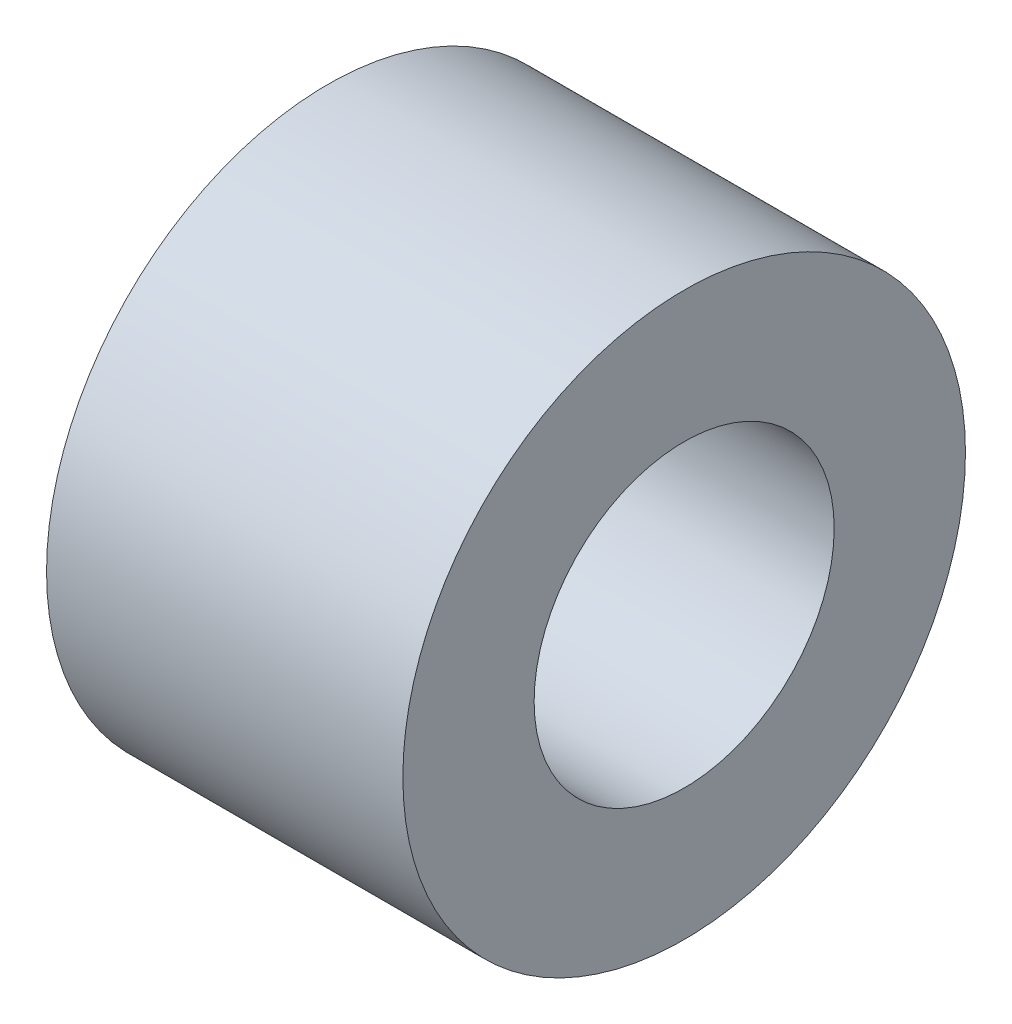
ISO-10303-21;
HEADER;
FILE_DESCRIPTION(('STEP AP214'),'2;1');
FILE_NAME('part.step','',(''),(''),'','','');
FILE_SCHEMA(('AUTOMOTIVE_DESIGN { 1 0 10303 214 1 1 1 1 }'));
ENDSEC;
DATA;
#1=APPLICATION_CONTEXT('core data for automotive mechanical design processes');
#2=APPLICATION_PROTOCOL_DEFINITION('international standard','automotive_design',2000,#1);
#3=PRODUCT_CONTEXT('',#1,'mechanical');
#4=PRODUCT('Part','Part','',(#3));
#5=PRODUCT_RELATED_PRODUCT_CATEGORY('part','',(#4));
#6=PRODUCT_DEFINITION_FORMATION('','',#4);
#7=PRODUCT_DEFINITION_CONTEXT('part definition',#1,'design');
#8=PRODUCT_DEFINITION('design','',#6,#7);
#9=PRODUCT_DEFINITION_SHAPE('','',#8);
#10=(LENGTH_UNIT() NAMED_UNIT(*) SI_UNIT(.MILLI.,.METRE.));
#11=(NAMED_UNIT(*) PLANE_ANGLE_UNIT() SI_UNIT($,.RADIAN.));
#12=(NAMED_UNIT(*) SI_UNIT($,.STERADIAN.) SOLID_ANGLE_UNIT());
#13=UNCERTAINTY_MEASURE_WITH_UNIT(LENGTH_MEASURE(1.E-05),#10,'distance_accuracy_value','');
#14=(GEOMETRIC_REPRESENTATION_CONTEXT(3) GLOBAL_UNCERTAINTY_ASSIGNED_CONTEXT((#13)) GLOBAL_UNIT_ASSIGNED_CONTEXT((#10,
#11,#12)) REPRESENTATION_CONTEXT('',''));
#15=CARTESIAN_POINT('',(0.,0.,0.));
#16=DIRECTION('',(0.,0.,1.));
#17=DIRECTION('',(1.,0.,0.));
#18=AXIS2_PLACEMENT_3D('',#15,#16,#17);
#19=CARTESIAN_POINT('',(3.8,0.,0.));
#20=DIRECTION('',(1.,0.,0.));
#21=DIRECTION('',(0.,0.,-1.));
#22=AXIS2_PLACEMENT_3D('',#19,#20,#21);
#23=PLANE('',#22);
#24=CARTESIAN_POINT('',(3.8,0.,0.));
#25=DIRECTION('',(1.,0.,0.));
#26=DIRECTION('',(0.,0.,-1.));
#27=AXIS2_PLACEMENT_3D('',#24,#25,#26);
#28=CIRCLE('',#27,3.);
#29=CARTESIAN_POINT('',(3.8,0.,3.));
#30=VERTEX_POINT('',#29);
#31=EDGE_CURVE('E10',#30,#30,#28,.T.);
#32=ORIENTED_EDGE('',*,*,#31,.T.);
#33=EDGE_LOOP('',(#32));
#34=FACE_BOUND('',#33,.T.);
#35=CARTESIAN_POINT('',(3.8,0.,0.));
#36=DIRECTION('',(1.,0.,0.));
#37=DIRECTION('',(0.,0.,-1.));
#38=AXIS2_PLACEMENT_3D('',#35,#36,#37);
#39=CIRCLE('',#38,1.6);
#40=CARTESIAN_POINT('',(3.8,0.,1.6));
#41=VERTEX_POINT('',#40);
#42=EDGE_CURVE('E43',#41,#41,#39,.T.);
#43=ORIENTED_EDGE('',*,*,#42,.F.);
#44=EDGE_LOOP('',(#43));
#45=FACE_BOUND('',#44,.T.);
#46=ADVANCED_FACE('F32',(#34,#45),#23,.T.);
#47=CARTESIAN_POINT('',(0.,0.,0.));
#48=DIRECTION('',(1.,0.,0.));
#49=DIRECTION('',(0.,0.,-1.));
#50=AXIS2_PLACEMENT_3D('',#47,#48,#49);
#51=PLANE('',#50);
#52=CARTESIAN_POINT('',(0.,0.,0.));
#53=DIRECTION('',(1.,0.,0.));
#54=DIRECTION('',(0.,0.,-1.));
#55=AXIS2_PLACEMENT_3D('',#52,#53,#54);
#56=CIRCLE('',#55,3.);
#57=CARTESIAN_POINT('',(0.,0.,3.));
#58=VERTEX_POINT('',#57);
#59=EDGE_CURVE('E36',#58,#58,#56,.T.);
#60=ORIENTED_EDGE('',*,*,#59,.F.);
#61=EDGE_LOOP('',(#60));
#62=FACE_BOUND('',#61,.T.);
#63=CARTESIAN_POINT('',(0.,0.,0.));
#64=DIRECTION('',(1.,0.,0.));
#65=DIRECTION('',(0.,0.,-1.));
#66=AXIS2_PLACEMENT_3D('',#63,#64,#65);
#67=CIRCLE('',#66,1.6);
#68=CARTESIAN_POINT('',(0.,0.,1.6));
#69=VERTEX_POINT('',#68);
#70=EDGE_CURVE('E45',#69,#69,#67,.T.);
#71=ORIENTED_EDGE('',*,*,#70,.T.);
#72=EDGE_LOOP('',(#71));
#73=FACE_BOUND('',#72,.T.);
#74=ADVANCED_FACE('F55',(#62,#73),#51,.F.);
#75=CARTESIAN_POINT('',(3.8,0.,0.));
#76=DIRECTION('',(-1.,0.,0.));
#77=DIRECTION('',(0.,0.,1.));
#78=AXIS2_PLACEMENT_3D('',#75,#76,#77);
#79=CYLINDRICAL_SURFACE('',#78,3.);
#80=CARTESIAN_POINT('',(3.8,0.,3.));
#81=CARTESIAN_POINT('',(3.76041666666667,0.,3.));
#82=CARTESIAN_POINT('',(3.72083333333333,0.,3.));
#83=CARTESIAN_POINT('',(3.64166666666667,0.,3.));
#84=CARTESIAN_POINT('',(3.60208333333333,0.,3.));
#85=CARTESIAN_POINT('',(3.52291666666667,0.,3.));
#86=CARTESIAN_POINT('',(3.48333333333333,0.,3.));
#87=CARTESIAN_POINT('',(3.40416666666667,0.,3.));
#88=CARTESIAN_POINT('',(3.36458333333333,0.,3.));
#89=CARTESIAN_POINT('',(3.28541666666667,0.,3.));
#90=CARTESIAN_POINT('',(3.24583333333333,0.,3.));
#91=CARTESIAN_POINT('',(3.16666666666667,0.,3.));
#92=CARTESIAN_POINT('',(3.12708333333333,0.,3.));
#93=CARTESIAN_POINT('',(3.04791666666667,0.,3.));
#94=CARTESIAN_POINT('',(3.00833333333333,0.,3.));
#95=CARTESIAN_POINT('',(2.92916666666667,0.,3.));
#96=CARTESIAN_POINT('',(2.88958333333333,0.,3.));
#97=CARTESIAN_POINT('',(2.81041666666667,0.,3.));
#98=CARTESIAN_POINT('',(2.77083333333333,0.,3.));
#99=CARTESIAN_POINT('',(2.69166666666667,0.,3.));
#100=CARTESIAN_POINT('',(2.65208333333333,0.,3.));
#101=CARTESIAN_POINT('',(2.57291666666667,0.,3.));
#102=CARTESIAN_POINT('',(2.53333333333333,0.,3.));
#103=CARTESIAN_POINT('',(2.45416666666667,0.,3.));
#104=CARTESIAN_POINT('',(2.41458333333333,0.,3.));
#105=CARTESIAN_POINT('',(2.33541666666667,0.,3.));
#106=CARTESIAN_POINT('',(2.29583333333333,0.,3.));
#107=CARTESIAN_POINT('',(2.21666666666667,0.,3.));
#108=CARTESIAN_POINT('',(2.17708333333333,0.,3.));
#109=CARTESIAN_POINT('',(2.09791666666667,0.,3.));
#110=CARTESIAN_POINT('',(2.05833333333333,0.,3.));
#111=CARTESIAN_POINT('',(1.97916666666667,0.,3.));
#112=CARTESIAN_POINT('',(1.93958333333333,0.,3.));
#113=CARTESIAN_POINT('',(1.86041666666667,0.,3.));
#114=CARTESIAN_POINT('',(1.82083333333333,0.,3.));
#115=CARTESIAN_POINT('',(1.74166666666667,0.,3.));
#116=CARTESIAN_POINT('',(1.70208333333333,0.,3.));
#117=CARTESIAN_POINT('',(1.62291666666667,0.,3.));
#118=CARTESIAN_POINT('',(1.58333333333333,0.,3.));
#119=CARTESIAN_POINT('',(1.50416666666667,0.,3.));
#120=CARTESIAN_POINT('',(1.46458333333333,0.,3.));
#121=CARTESIAN_POINT('',(1.38541666666667,0.,3.));
#122=CARTESIAN_POINT('',(1.34583333333333,0.,3.));
#123=CARTESIAN_POINT('',(1.26666666666667,0.,3.));
#124=CARTESIAN_POINT('',(1.22708333333333,0.,3.));
#125=CARTESIAN_POINT('',(1.14791666666667,0.,3.));
#126=CARTESIAN_POINT('',(1.10833333333333,0.,3.));
#127=CARTESIAN_POINT('',(1.02916666666667,0.,3.));
#128=CARTESIAN_POINT('',(0.989583333333333,0.,3.));
#129=CARTESIAN_POINT('',(0.910416666666667,0.,3.));
#130=CARTESIAN_POINT('',(0.870833333333333,0.,3.));
#131=CARTESIAN_POINT('',(0.791666666666667,0.,3.));
#132=CARTESIAN_POINT('',(0.752083333333333,0.,3.));
#133=CARTESIAN_POINT('',(0.672916666666667,0.,3.));
#134=CARTESIAN_POINT('',(0.633333333333333,0.,3.));
#135=CARTESIAN_POINT('',(0.554166666666667,0.,3.));
#136=CARTESIAN_POINT('',(0.514583333333334,0.,3.));
#137=CARTESIAN_POINT('',(0.435416666666667,0.,3.));
#138=CARTESIAN_POINT('',(0.395833333333333,0.,3.));
#139=CARTESIAN_POINT('',(0.316666666666666,0.,3.));
#140=CARTESIAN_POINT('',(0.277083333333333,0.,3.));
#141=CARTESIAN_POINT('',(0.197916666666667,0.,3.));
#142=CARTESIAN_POINT('',(0.158333333333333,0.,3.));
#143=CARTESIAN_POINT('',(0.0791666666666666,0.,3.));
#144=CARTESIAN_POINT('',(0.0395833333333333,0.,3.));
#145=CARTESIAN_POINT('',(0.,0.,3.));
#146=B_SPLINE_CURVE_WITH_KNOTS('',3,(#80,#81,#82,#83,#84,#85,#86,#87,#88,#89,#90,#91,#92,#93,
#94,#95,#96,#97,#98,#99,#100,#101,#102,#103,#104,#105,#106,#107,#108,#109,#110,#111,#112,#113,
#114,#115,#116,#117,#118,#119,#120,#121,#122,#123,#124,#125,#126,#127,#128,#129,#130,#131,#132,
#133,#134,#135,#136,#137,#138,#139,#140,#141,#142,#143,#144,#145),.UNSPECIFIED.,.F.,.F.,(4,2,2,
2,2,2,2,2,2,2,2,2,2,2,2,2,2,2,2,2,2,2,2,2,2,2,2,2,2,2,2,2,4),(0.,0.11875,0.2375,0.35625,0.475,
0.59375,0.7125,0.831249999999999,0.95,1.06875,1.1875,1.30625,1.425,1.54375,1.6625,1.78125,1.9,
2.01875,2.1375,2.25625,2.375,2.49375,2.6125,2.73125,2.85,2.96875,3.0875,3.20625,3.325,3.44375,
3.5625,3.68125,3.8),.UNSPECIFIED.);
#147=EDGE_CURVE('BSEAM34',#30,#58,#146,.T.);
#148=ORIENTED_EDGE('',*,*,#31,.F.);
#149=ORIENTED_EDGE('',*,*,#59,.T.);
#150=ORIENTED_EDGE('',*,*,#147,.T.);
#151=ORIENTED_EDGE('',*,*,#147,.F.);
#152=EDGE_LOOP('',(#148,#150,#149,#151));
#153=FACE_BOUND('',#152,.T.);
#154=ADVANCED_FACE('F34',(#153),#79,.T.);
#155=CARTESIAN_POINT('',(3.8,0.,0.));
#156=DIRECTION('',(-1.,0.,0.));
#157=DIRECTION('',(0.,0.,1.));
#158=AXIS2_PLACEMENT_3D('',#155,#156,#157);
#159=CYLINDRICAL_SURFACE('',#158,1.6);
#160=CARTESIAN_POINT('',(3.8,0.,1.6));
#161=CARTESIAN_POINT('',(3.76041666666667,0.,1.6));
#162=CARTESIAN_POINT('',(3.72083333333333,0.,1.6));
#163=CARTESIAN_POINT('',(3.64166666666667,0.,1.6));
#164=CARTESIAN_POINT('',(3.60208333333333,0.,1.6));
#165=CARTESIAN_POINT('',(3.52291666666667,0.,1.6));
#166=CARTESIAN_POINT('',(3.48333333333333,0.,1.6));
#167=CARTESIAN_POINT('',(3.40416666666667,0.,1.6));
#168=CARTESIAN_POINT('',(3.36458333333333,0.,1.6));
#169=CARTESIAN_POINT('',(3.28541666666667,0.,1.6));
#170=CARTESIAN_POINT('',(3.24583333333333,0.,1.6));
#171=CARTESIAN_POINT('',(3.16666666666667,0.,1.6));
#172=CARTESIAN_POINT('',(3.12708333333333,0.,1.6));
#173=CARTESIAN_POINT('',(3.04791666666667,0.,1.6));
#174=CARTESIAN_POINT('',(3.00833333333333,0.,1.6));
#175=CARTESIAN_POINT('',(2.92916666666667,0.,1.6));
#176=CARTESIAN_POINT('',(2.88958333333333,0.,1.6));
#177=CARTESIAN_POINT('',(2.81041666666667,0.,1.6));
#178=CARTESIAN_POINT('',(2.77083333333333,0.,1.6));
#179=CARTESIAN_POINT('',(2.69166666666667,0.,1.6));
#180=CARTESIAN_POINT('',(2.65208333333333,0.,1.6));
#181=CARTESIAN_POINT('',(2.57291666666667,0.,1.6));
#182=CARTESIAN_POINT('',(2.53333333333333,0.,1.6));
#183=CARTESIAN_POINT('',(2.45416666666667,0.,1.6));
#184=CARTESIAN_POINT('',(2.41458333333333,0.,1.6));
#185=CARTESIAN_POINT('',(2.33541666666667,0.,1.6));
#186=CARTESIAN_POINT('',(2.29583333333333,0.,1.6));
#187=CARTESIAN_POINT('',(2.21666666666667,0.,1.6));
#188=CARTESIAN_POINT('',(2.17708333333333,0.,1.6));
#189=CARTESIAN_POINT('',(2.09791666666667,0.,1.6));
#190=CARTESIAN_POINT('',(2.05833333333333,0.,1.6));
#191=CARTESIAN_POINT('',(1.97916666666667,0.,1.6));
#192=CARTESIAN_POINT('',(1.93958333333333,0.,1.6));
#193=CARTESIAN_POINT('',(1.86041666666667,0.,1.6));
#194=CARTESIAN_POINT('',(1.82083333333333,0.,1.6));
#195=CARTESIAN_POINT('',(1.74166666666667,0.,1.6));
#196=CARTESIAN_POINT('',(1.70208333333333,0.,1.6));
#197=CARTESIAN_POINT('',(1.62291666666667,0.,1.6));
#198=CARTESIAN_POINT('',(1.58333333333333,0.,1.6));
#199=CARTESIAN_POINT('',(1.50416666666667,0.,1.6));
#200=CARTESIAN_POINT('',(1.46458333333333,0.,1.6));
#201=CARTESIAN_POINT('',(1.38541666666667,0.,1.6));
#202=CARTESIAN_POINT('',(1.34583333333333,0.,1.6));
#203=CARTESIAN_POINT('',(1.26666666666667,0.,1.6));
#204=CARTESIAN_POINT('',(1.22708333333333,0.,1.6));
#205=CARTESIAN_POINT('',(1.14791666666667,0.,1.6));
#206=CARTESIAN_POINT('',(1.10833333333333,0.,1.6));
#207=CARTESIAN_POINT('',(1.02916666666667,0.,1.6));
#208=CARTESIAN_POINT('',(0.989583333333334,0.,1.6));
#209=CARTESIAN_POINT('',(0.910416666666667,0.,1.6));
#210=CARTESIAN_POINT('',(0.870833333333333,0.,1.6));
#211=CARTESIAN_POINT('',(0.791666666666667,0.,1.6));
#212=CARTESIAN_POINT('',(0.752083333333333,0.,1.6));
#213=CARTESIAN_POINT('',(0.672916666666667,0.,1.6));
#214=CARTESIAN_POINT('',(0.633333333333333,0.,1.6));
#215=CARTESIAN_POINT('',(0.554166666666667,0.,1.6));
#216=CARTESIAN_POINT('',(0.514583333333334,0.,1.6));
#217=CARTESIAN_POINT('',(0.435416666666667,0.,1.6));
#218=CARTESIAN_POINT('',(0.395833333333334,0.,1.6));
#219=CARTESIAN_POINT('',(0.316666666666667,0.,1.6));
#220=CARTESIAN_POINT('',(0.277083333333333,0.,1.6));
#221=CARTESIAN_POINT('',(0.197916666666667,0.,1.6));
#222=CARTESIAN_POINT('',(0.158333333333333,0.,1.6));
#223=CARTESIAN_POINT('',(0.0791666666666666,0.,1.6));
#224=CARTESIAN_POINT('',(0.0395833333333333,0.,1.6));
#225=CARTESIAN_POINT('',(0.,0.,1.6));
#226=B_SPLINE_CURVE_WITH_KNOTS('',3,(#160,#161,#162,#163,#164,#165,#166,#167,#168,#169,#170,
#171,#172,#173,#174,#175,#176,#177,#178,#179,#180,#181,#182,#183,#184,#185,#186,#187,#188,#189,
#190,#191,#192,#193,#194,#195,#196,#197,#198,#199,#200,#201,#202,#203,#204,#205,#206,#207,#208,
#209,#210,#211,#212,#213,#214,#215,#216,#217,#218,#219,#220,#221,#222,#223,#224,#225),
.UNSPECIFIED.,.F.,.F.,(4,2,2,2,2,2,2,2,2,2,2,2,2,2,2,2,2,2,2,2,2,2,2,2,2,2,2,2,2,2,2,2,4),(0.,
0.11875,0.2375,0.35625,0.475,0.59375,0.7125,0.83125,0.95,1.06875,1.1875,1.30625,1.425,1.54375,
1.6625,1.78125,1.9,2.01875,2.1375,2.25625,2.375,2.49375,2.6125,2.73125,2.85,2.96875,3.0875,
3.20625,3.325,3.44375,3.5625,3.68125,3.8),.UNSPECIFIED.);
#227=EDGE_CURVE('BSEAM51',#41,#69,#226,.T.);
#228=ORIENTED_EDGE('',*,*,#42,.T.);
#229=ORIENTED_EDGE('',*,*,#70,.F.);
#230=ORIENTED_EDGE('',*,*,#227,.T.);
#231=ORIENTED_EDGE('',*,*,#227,.F.);
#232=EDGE_LOOP('',(#228,#230,#229,#231));
#233=FACE_BOUND('',#232,.T.);
#234=ADVANCED_FACE('F51',(#233),#159,.F.);
#235=CLOSED_SHELL('',(#46,#74,#154,#234));
#236=MANIFOLD_SOLID_BREP('B2',#235);
#237=ADVANCED_BREP_SHAPE_REPRESENTATION('',(#18,#236),#14);
#238=SHAPE_DEFINITION_REPRESENTATION(#9,#237);
ENDSEC;
END-ISO-10303-21;
